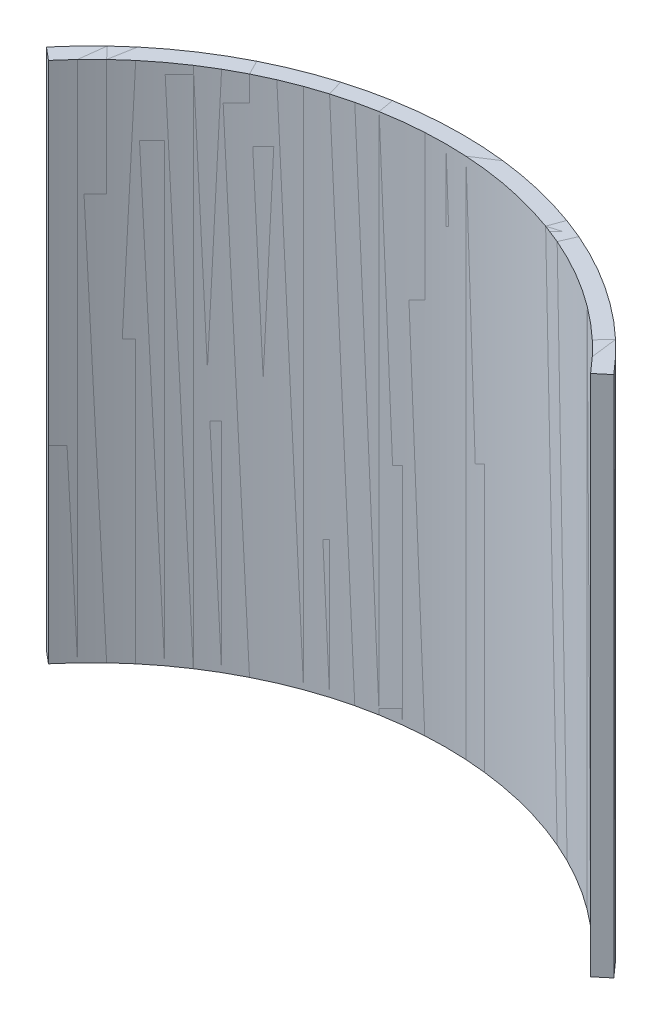
ISO-10303-21;
HEADER;
FILE_DESCRIPTION(('STEP AP214'),'2;1');
FILE_NAME('part.step','',(''),(''),'','','');
FILE_SCHEMA(('AUTOMOTIVE_DESIGN { 1 0 10303 214 1 1 1 1 }'));
ENDSEC;
DATA;
#1=APPLICATION_CONTEXT('core data for automotive mechanical design processes');
#2=APPLICATION_PROTOCOL_DEFINITION('international standard','automotive_design',2000,#1);
#3=PRODUCT_CONTEXT('',#1,'mechanical');
#4=PRODUCT('Part','Part','',(#3));
#5=PRODUCT_RELATED_PRODUCT_CATEGORY('part','',(#4));
#6=PRODUCT_DEFINITION_FORMATION('','',#4);
#7=PRODUCT_DEFINITION_CONTEXT('part definition',#1,'design');
#8=PRODUCT_DEFINITION('design','',#6,#7);
#9=PRODUCT_DEFINITION_SHAPE('','',#8);
#10=(LENGTH_UNIT() NAMED_UNIT(*) SI_UNIT(.MILLI.,.METRE.));
#11=(NAMED_UNIT(*) PLANE_ANGLE_UNIT() SI_UNIT($,.RADIAN.));
#12=(NAMED_UNIT(*) SI_UNIT($,.STERADIAN.) SOLID_ANGLE_UNIT());
#13=UNCERTAINTY_MEASURE_WITH_UNIT(LENGTH_MEASURE(1.E-05),#10,'distance_accuracy_value','');
#14=(GEOMETRIC_REPRESENTATION_CONTEXT(3) GLOBAL_UNCERTAINTY_ASSIGNED_CONTEXT((#13)) GLOBAL_UNIT_ASSIGNED_CONTEXT((#10,
#11,#12)) REPRESENTATION_CONTEXT('',''));
#15=CARTESIAN_POINT('',(0.,0.,0.));
#16=DIRECTION('',(0.,0.,1.));
#17=DIRECTION('',(1.,0.,0.));
#18=AXIS2_PLACEMENT_3D('',#15,#16,#17);
#19=CARTESIAN_POINT('',(32.6005100394403,15.5,-27.3550759502854));
#20=DIRECTION('',(0.,1.,0.));
#21=DIRECTION('',(0.,0.,1.));
#22=AXIS2_PLACEMENT_3D('',#19,#20,#21);
#23=PLANE('',#22);
#24=CARTESIAN_POINT('',(0.,15.5,0.));
#25=DIRECTION('',(0.,1.,0.));
#26=DIRECTION('',(0.,0.,1.));
#27=AXIS2_PLACEMENT_3D('',#24,#25,#26);
#28=CIRCLE('',#27,43.);
#29=CARTESIAN_POINT('',(-32.9399110541161,15.5,-27.6398672165211));
#30=VERTEX_POINT('',#29);
#31=CARTESIAN_POINT('',(32.9399110541161,15.5,-27.6398672165211));
#32=VERTEX_POINT('',#31);
#33=EDGE_CURVE('E108',#30,#32,#28,.F.);
#34=ORIENTED_EDGE('',*,*,#33,.F.);
#35=DIRECTION('',(-0.766044443118979,0.,-0.642787609686538));
#36=VECTOR('',#35,1.);
#37=CARTESIAN_POINT('',(-32.6005100394403,15.5,-27.3550759502854));
#38=LINE('',#37,#36);
#39=CARTESIAN_POINT('',(-34.4719999403541,15.5,-28.9254424358942));
#40=VERTEX_POINT('',#39);
#41=EDGE_CURVE('E13',#30,#40,#38,.T.);
#42=ORIENTED_EDGE('',*,*,#41,.T.);
#43=CARTESIAN_POINT('',(0.,15.5,0.));
#44=DIRECTION('',(0.,-1.,0.));
#45=DIRECTION('',(0.,0.,-1.));
#46=AXIS2_PLACEMENT_3D('',#43,#44,#45);
#47=CIRCLE('',#46,45.);
#48=CARTESIAN_POINT('',(34.4719999403541,15.5,-28.9254424358942));
#49=VERTEX_POINT('',#48);
#50=EDGE_CURVE('E134',#49,#40,#47,.F.);
#51=ORIENTED_EDGE('',*,*,#50,.F.);
#52=DIRECTION('',(0.766044443118979,0.,-0.642787609686538));
#53=VECTOR('',#52,1.);
#54=CARTESIAN_POINT('',(32.6005100394403,15.5,-27.3550759502854));
#55=LINE('',#54,#53);
#56=EDGE_CURVE('E140',#32,#49,#55,.T.);
#57=ORIENTED_EDGE('',*,*,#56,.F.);
#58=EDGE_LOOP('',(#34,#42,#51,#57));
#59=FACE_BOUND('',#58,.T.);
#60=ADVANCED_FACE('F83',(#59),#23,.F.);
#61=CARTESIAN_POINT('',(0.,79.,0.));
#62=DIRECTION('',(0.,1.,0.));
#63=DIRECTION('',(0.,0.,1.));
#64=AXIS2_PLACEMENT_3D('',#61,#62,#63);
#65=PLANE('',#64);
#66=DIRECTION('',(-0.766044443118979,0.,0.642787609686538));
#67=VECTOR('',#66,1.);
#68=CARTESIAN_POINT('',(32.6005100394403,79.,-27.3550759502854));
#69=LINE('',#68,#67);
#70=CARTESIAN_POINT('',(34.4719999403541,79.,-28.9254424358942));
#71=VERTEX_POINT('',#70);
#72=CARTESIAN_POINT('',(32.9399110541161,79.,-27.6398672165211));
#73=VERTEX_POINT('',#72);
#74=EDGE_CURVE('E162',#71,#73,#69,.T.);
#75=ORIENTED_EDGE('',*,*,#74,.F.);
#76=CARTESIAN_POINT('',(0.,79.,0.));
#77=DIRECTION('',(0.,-1.,0.));
#78=DIRECTION('',(0.,0.,-1.));
#79=AXIS2_PLACEMENT_3D('',#76,#77,#78);
#80=CIRCLE('',#79,45.);
#81=CARTESIAN_POINT('',(-34.4719999403541,79.,-28.9254424358942));
#82=VERTEX_POINT('',#81);
#83=EDGE_CURVE('E101',#71,#82,#80,.F.);
#84=ORIENTED_EDGE('',*,*,#83,.T.);
#85=DIRECTION('',(0.766044443118979,0.,0.642787609686538));
#86=VECTOR('',#85,1.);
#87=CARTESIAN_POINT('',(-32.6005100394403,79.,-27.3550759502854));
#88=LINE('',#87,#86);
#89=CARTESIAN_POINT('',(-32.9399110541161,79.,-27.6398672165211));
#90=VERTEX_POINT('',#89);
#91=EDGE_CURVE('E93',#82,#90,#88,.T.);
#92=ORIENTED_EDGE('',*,*,#91,.T.);
#93=CARTESIAN_POINT('',(0.,79.,0.));
#94=DIRECTION('',(0.,1.,0.));
#95=DIRECTION('',(0.766044443118979,0.,-0.642787609686538));
#96=AXIS2_PLACEMENT_3D('',#93,#94,#95);
#97=CIRCLE('',#96,43.);
#98=EDGE_CURVE('E87',#73,#90,#97,.T.);
#99=ORIENTED_EDGE('',*,*,#98,.F.);
#100=EDGE_LOOP('',(#75,#84,#92,#99));
#101=FACE_BOUND('',#100,.T.);
#102=ADVANCED_FACE('F136',(#101),#65,.T.);
#103=CARTESIAN_POINT('',(0.,0.,0.));
#104=DIRECTION('',(0.642787609686538,0.,0.766044443118979));
#105=DIRECTION('',(0.766044443118979,0.,-0.642787609686538));
#106=AXIS2_PLACEMENT_3D('',#103,#104,#105);
#107=PLANE('',#106);
#108=ORIENTED_EDGE('',*,*,#74,.T.);
#109=DIRECTION('',(0.,1.,0.));
#110=VECTOR('',#109,1.);
#111=CARTESIAN_POINT('',(32.9399110541161,14.,-27.6398672165211));
#112=LINE('',#111,#110);
#113=EDGE_CURVE('E132',#73,#32,#112,.F.);
#114=ORIENTED_EDGE('',*,*,#113,.T.);
#115=ORIENTED_EDGE('',*,*,#56,.T.);
#116=DIRECTION('',(0.,-1.,0.));
#117=VECTOR('',#116,1.);
#118=CARTESIAN_POINT('',(34.4719999403541,2.,-28.9254424358942));
#119=LINE('',#118,#117);
#120=EDGE_CURVE('E144',#71,#49,#119,.T.);
#121=ORIENTED_EDGE('',*,*,#120,.F.);
#122=EDGE_LOOP('',(#108,#114,#115,#121));
#123=FACE_BOUND('',#122,.T.);
#124=ADVANCED_FACE('F173',(#123),#107,.T.);
#125=CARTESIAN_POINT('',(0.,0.,0.));
#126=DIRECTION('',(0.642787609686538,0.,-0.766044443118979));
#127=DIRECTION('',(-0.766044443118979,0.,-0.642787609686538));
#128=AXIS2_PLACEMENT_3D('',#125,#126,#127);
#129=PLANE('',#128);
#130=DIRECTION('',(0.,1.,0.));
#131=VECTOR('',#130,1.);
#132=CARTESIAN_POINT('',(-32.9399110541161,14.,-27.6398672165211));
#133=LINE('',#132,#131);
#134=EDGE_CURVE('E130',#90,#30,#133,.F.);
#135=ORIENTED_EDGE('',*,*,#134,.F.);
#136=ORIENTED_EDGE('',*,*,#91,.F.);
#137=DIRECTION('',(0.,-1.,0.));
#138=VECTOR('',#137,1.);
#139=CARTESIAN_POINT('',(-34.4719999403541,2.,-28.9254424358942));
#140=LINE('',#139,#138);
#141=EDGE_CURVE('E152',#82,#40,#140,.T.);
#142=ORIENTED_EDGE('',*,*,#141,.T.);
#143=ORIENTED_EDGE('',*,*,#41,.F.);
#144=EDGE_LOOP('',(#135,#136,#142,#143));
#145=FACE_BOUND('',#144,.T.);
#146=ADVANCED_FACE('F142',(#145),#129,.F.);
#147=CARTESIAN_POINT('',(0.,15.5,0.));
#148=DIRECTION('',(0.,1.,0.));
#149=DIRECTION('',(0.,0.,1.));
#150=AXIS2_PLACEMENT_3D('',#147,#148,#149);
#151=CYLINDRICAL_SURFACE('',#150,43.);
#152=ORIENTED_EDGE('',*,*,#98,.T.);
#153=ORIENTED_EDGE('',*,*,#134,.T.);
#154=ORIENTED_EDGE('',*,*,#33,.T.);
#155=ORIENTED_EDGE('',*,*,#113,.F.);
#156=EDGE_LOOP('',(#152,#153,#154,#155));
#157=FACE_BOUND('',#156,.T.);
#158=ADVANCED_FACE('F128',(#157),#151,.F.);
#159=CARTESIAN_POINT('',(0.,15.5,0.));
#160=DIRECTION('',(0.,1.,0.));
#161=DIRECTION('',(0.,0.,1.));
#162=AXIS2_PLACEMENT_3D('',#159,#160,#161);
#163=CYLINDRICAL_SURFACE('',#162,45.);
#164=ORIENTED_EDGE('',*,*,#50,.T.);
#165=ORIENTED_EDGE('',*,*,#141,.F.);
#166=ORIENTED_EDGE('',*,*,#83,.F.);
#167=ORIENTED_EDGE('',*,*,#120,.T.);
#168=EDGE_LOOP('',(#164,#165,#166,#167));
#169=FACE_BOUND('',#168,.T.);
#170=ADVANCED_FACE('F85',(#169),#163,.T.);
#171=CLOSED_SHELL('',(#60,#102,#124,#146,#158,#170));
#172=MANIFOLD_SOLID_BREP('B2',#171);
#173=CARTESIAN_POINT('',(34.4719999403541,15.5,-28.9254424358942));
#174=DIRECTION('',(0.,-1.,0.));
#175=DIRECTION('',(0.,0.,-1.));
#176=AXIS2_PLACEMENT_3D('',#173,#174,#175);
#177=PLANE('',#176);
#178=DIRECTION('',(0.766044443118979,0.,0.642787609686538));
#179=VECTOR('',#178,1.);
#180=CARTESIAN_POINT('',(-34.4719999403541,15.5,-28.9254424358942));
#181=LINE('',#180,#179);
#182=CARTESIAN_POINT('',(-34.4719999403541,15.5,-28.9254424358942));
#183=VERTEX_POINT('',#182);
#184=CARTESIAN_POINT('',(-32.9399110541161,15.5,-27.6398672165211));
#185=VERTEX_POINT('',#184);
#186=EDGE_CURVE('E81',#183,#185,#181,.T.);
#187=ORIENTED_EDGE('',*,*,#186,.F.);
#188=CARTESIAN_POINT('',(0.,15.5,0.));
#189=DIRECTION('',(0.,1.,0.));
#190=DIRECTION('',(0.766044443118979,0.,-0.642787609686538));
#191=AXIS2_PLACEMENT_3D('',#188,#189,#190);
#192=CIRCLE('',#191,45.);
#193=CARTESIAN_POINT('',(34.4719999403541,15.5,-28.9254424358942));
#194=VERTEX_POINT('',#193);
#195=EDGE_CURVE('E237',#194,#183,#192,.T.);
#196=ORIENTED_EDGE('',*,*,#195,.F.);
#197=DIRECTION('',(-0.766044443118979,0.,0.642787609686538));
#198=VECTOR('',#197,1.);
#199=CARTESIAN_POINT('',(34.4719999403541,15.5,-28.9254424358942));
#200=LINE('',#199,#198);
#201=CARTESIAN_POINT('',(32.9399110541161,15.5,-27.6398672165211));
#202=VERTEX_POINT('',#201);
#203=EDGE_CURVE('E283',#194,#202,#200,.T.);
#204=ORIENTED_EDGE('',*,*,#203,.T.);
#205=CARTESIAN_POINT('',(0.,15.5,0.));
#206=DIRECTION('',(0.,1.,0.));
#207=DIRECTION('',(0.766044443118979,0.,-0.642787609686538));
#208=AXIS2_PLACEMENT_3D('',#205,#206,#207);
#209=CIRCLE('',#208,43.);
#210=EDGE_CURVE('E284',#202,#185,#209,.T.);
#211=ORIENTED_EDGE('',*,*,#210,.T.);
#212=EDGE_LOOP('',(#187,#196,#204,#211));
#213=FACE_BOUND('',#212,.T.);
#214=ADVANCED_FACE('F231',(#213),#177,.T.);
#215=CARTESIAN_POINT('',(0.,15.5,0.));
#216=DIRECTION('',(0.,1.,0.));
#217=DIRECTION('',(0.,0.,1.));
#218=AXIS2_PLACEMENT_3D('',#215,#216,#217);
#219=CYLINDRICAL_SURFACE('',#218,45.);
#220=ORIENTED_EDGE('',*,*,#195,.T.);
#221=DIRECTION('',(0.,-1.,0.));
#222=VECTOR('',#221,1.);
#223=CARTESIAN_POINT('',(-34.4719999403541,79.,-28.9254424358942));
#224=LINE('',#223,#222);
#225=CARTESIAN_POINT('',(-34.4719999403541,79.,-28.9254424358942));
#226=VERTEX_POINT('',#225);
#227=EDGE_CURVE('E241',#226,#183,#224,.T.);
#228=ORIENTED_EDGE('',*,*,#227,.F.);
#229=CARTESIAN_POINT('',(0.,79.,0.));
#230=DIRECTION('',(0.,1.,0.));
#231=DIRECTION('',(0.766044443118979,0.,-0.642787609686538));
#232=AXIS2_PLACEMENT_3D('',#229,#230,#231);
#233=CIRCLE('',#232,45.);
#234=CARTESIAN_POINT('',(34.4719999403541,79.,-28.9254424358942));
#235=VERTEX_POINT('',#234);
#236=EDGE_CURVE('E300',#235,#226,#233,.T.);
#237=ORIENTED_EDGE('',*,*,#236,.F.);
#238=DIRECTION('',(0.,-1.,0.));
#239=VECTOR('',#238,1.);
#240=CARTESIAN_POINT('',(34.4719999403541,79.,-28.9254424358942));
#241=LINE('',#240,#239);
#242=EDGE_CURVE('E257',#235,#194,#241,.T.);
#243=ORIENTED_EDGE('',*,*,#242,.T.);
#244=EDGE_LOOP('',(#220,#228,#237,#243));
#245=FACE_BOUND('',#244,.T.);
#246=ADVANCED_FACE('F306',(#245),#219,.T.);
#247=CARTESIAN_POINT('',(32.9399110541161,79.,-27.6398672165211));
#248=DIRECTION('',(0.,1.,0.));
#249=DIRECTION('',(0.,0.,1.));
#250=AXIS2_PLACEMENT_3D('',#247,#248,#249);
#251=PLANE('',#250);
#252=ORIENTED_EDGE('',*,*,#236,.T.);
#253=DIRECTION('',(-0.766044443118978,0.,-0.642787609686539));
#254=VECTOR('',#253,1.);
#255=CARTESIAN_POINT('',(-32.9399110541161,79.,-27.6398672165211));
#256=LINE('',#255,#254);
#257=CARTESIAN_POINT('',(-32.9399110541161,79.,-27.6398672165211));
#258=VERTEX_POINT('',#257);
#259=EDGE_CURVE('E297',#258,#226,#256,.T.);
#260=ORIENTED_EDGE('',*,*,#259,.F.);
#261=CARTESIAN_POINT('',(0.,79.,0.));
#262=DIRECTION('',(0.,1.,0.));
#263=DIRECTION('',(0.766044443118979,0.,-0.642787609686538));
#264=AXIS2_PLACEMENT_3D('',#261,#262,#263);
#265=CIRCLE('',#264,43.);
#266=CARTESIAN_POINT('',(32.9399110541161,79.,-27.6398672165211));
#267=VERTEX_POINT('',#266);
#268=EDGE_CURVE('E291',#267,#258,#265,.T.);
#269=ORIENTED_EDGE('',*,*,#268,.F.);
#270=DIRECTION('',(0.76604444311898,0.,-0.642787609686537));
#271=VECTOR('',#270,1.);
#272=CARTESIAN_POINT('',(32.9399110541161,79.,-27.6398672165211));
#273=LINE('',#272,#271);
#274=EDGE_CURVE('E267',#267,#235,#273,.T.);
#275=ORIENTED_EDGE('',*,*,#274,.T.);
#276=EDGE_LOOP('',(#252,#260,#269,#275));
#277=FACE_BOUND('',#276,.T.);
#278=ADVANCED_FACE('F308',(#277),#251,.T.);
#279=CARTESIAN_POINT('',(0.,15.5,0.));
#280=DIRECTION('',(0.,1.,0.));
#281=DIRECTION('',(0.,0.,1.));
#282=AXIS2_PLACEMENT_3D('',#279,#280,#281);
#283=CYLINDRICAL_SURFACE('',#282,43.);
#284=ORIENTED_EDGE('',*,*,#268,.T.);
#285=DIRECTION('',(0.,1.,0.));
#286=VECTOR('',#285,1.);
#287=CARTESIAN_POINT('',(-32.9399110541161,15.5,-27.6398672165211));
#288=LINE('',#287,#286);
#289=EDGE_CURVE('E288',#185,#258,#288,.T.);
#290=ORIENTED_EDGE('',*,*,#289,.F.);
#291=ORIENTED_EDGE('',*,*,#210,.F.);
#292=DIRECTION('',(0.,1.,0.));
#293=VECTOR('',#292,1.);
#294=CARTESIAN_POINT('',(32.9399110541161,15.5,-27.6398672165211));
#295=LINE('',#294,#293);
#296=EDGE_CURVE('E275',#202,#267,#295,.T.);
#297=ORIENTED_EDGE('',*,*,#296,.T.);
#298=EDGE_LOOP('',(#284,#290,#291,#297));
#299=FACE_BOUND('',#298,.T.);
#300=ADVANCED_FACE('F286',(#299),#283,.F.);
#301=OPEN_SHELL('',(#214,#246,#278,#300));
#302=SHELL_BASED_SURFACE_MODEL('B7',(#301));
#303=ADVANCED_BREP_SHAPE_REPRESENTATION('',(#18,#172),#14);
#304=MANIFOLD_SURFACE_SHAPE_REPRESENTATION('',(#18,#302),#14);
#305=SHAPE_REPRESENTATION('',(#18),#14);
#306=SHAPE_DEFINITION_REPRESENTATION(#9,#305);
#307=SHAPE_REPRESENTATION_RELATIONSHIP('','',#305,#303);
#308=SHAPE_REPRESENTATION_RELATIONSHIP('','',#305,#304);
ENDSEC;
END-ISO-10303-21;
